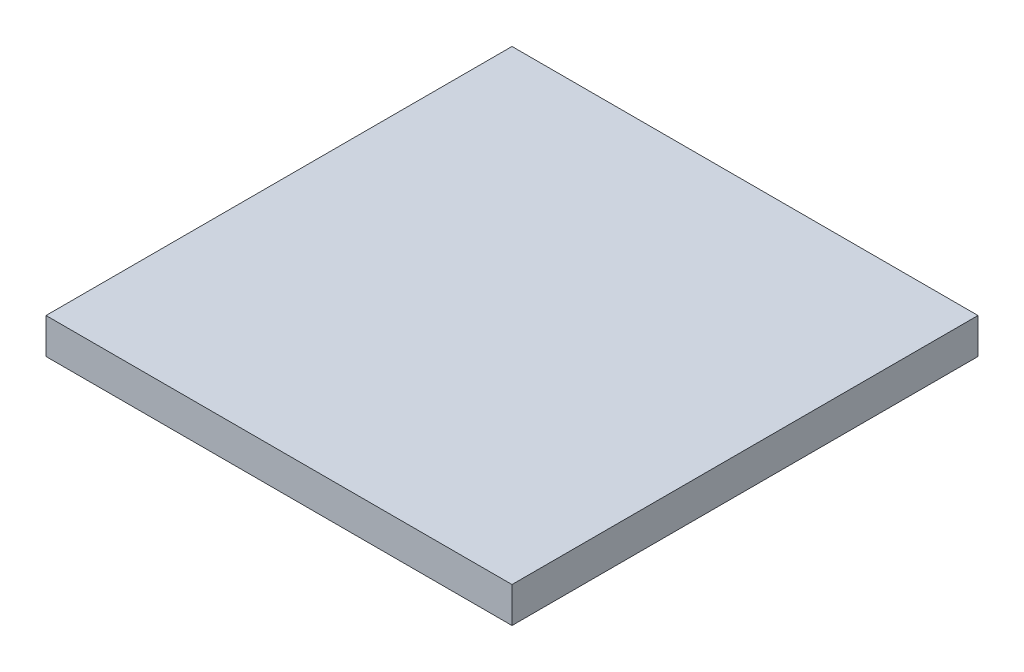
ISO-10303-21;
HEADER;
FILE_DESCRIPTION(('STEP AP214'),'2;1');
FILE_NAME('part.step','',(''),(''),'','','');
FILE_SCHEMA(('AUTOMOTIVE_DESIGN { 1 0 10303 214 1 1 1 1 }'));
ENDSEC;
DATA;
#1=APPLICATION_CONTEXT('core data for automotive mechanical design processes');
#2=APPLICATION_PROTOCOL_DEFINITION('international standard','automotive_design',2000,#1);
#3=PRODUCT_CONTEXT('',#1,'mechanical');
#4=PRODUCT('Part','Part','',(#3));
#5=PRODUCT_RELATED_PRODUCT_CATEGORY('part','',(#4));
#6=PRODUCT_DEFINITION_FORMATION('','',#4);
#7=PRODUCT_DEFINITION_CONTEXT('part definition',#1,'design');
#8=PRODUCT_DEFINITION('design','',#6,#7);
#9=PRODUCT_DEFINITION_SHAPE('','',#8);
#10=(LENGTH_UNIT() NAMED_UNIT(*) SI_UNIT(.MILLI.,.METRE.));
#11=(NAMED_UNIT(*) PLANE_ANGLE_UNIT() SI_UNIT($,.RADIAN.));
#12=(NAMED_UNIT(*) SI_UNIT($,.STERADIAN.) SOLID_ANGLE_UNIT());
#13=UNCERTAINTY_MEASURE_WITH_UNIT(LENGTH_MEASURE(1.E-05),#10,'distance_accuracy_value','');
#14=(GEOMETRIC_REPRESENTATION_CONTEXT(3) GLOBAL_UNCERTAINTY_ASSIGNED_CONTEXT((#13)) GLOBAL_UNIT_ASSIGNED_CONTEXT((#10,
#11,#12)) REPRESENTATION_CONTEXT('',''));
#15=CARTESIAN_POINT('',(0.,0.,0.));
#16=DIRECTION('',(0.,0.,1.));
#17=DIRECTION('',(1.,0.,0.));
#18=AXIS2_PLACEMENT_3D('',#15,#16,#17);
#19=CARTESIAN_POINT('',(0.,3.05,0.));
#20=DIRECTION('',(1.,0.,0.));
#21=DIRECTION('',(0.,0.,-1.));
#22=AXIS2_PLACEMENT_3D('',#19,#20,#21);
#23=PLANE('',#22);
#24=DIRECTION('',(0.,0.,1.));
#25=VECTOR('',#24,1.);
#26=CARTESIAN_POINT('',(0.,0.,0.));
#27=LINE('',#26,#25);
#28=CARTESIAN_POINT('',(0.,0.,-40.));
#29=VERTEX_POINT('',#28);
#30=CARTESIAN_POINT('',(0.,0.,0.));
#31=VERTEX_POINT('',#30);
#32=EDGE_CURVE('E111',#29,#31,#27,.T.);
#33=ORIENTED_EDGE('',*,*,#32,.T.);
#34=DIRECTION('',(0.,-1.,0.));
#35=VECTOR('',#34,1.);
#36=CARTESIAN_POINT('',(0.,3.05,0.));
#37=LINE('',#36,#35);
#38=CARTESIAN_POINT('',(0.,3.05,0.));
#39=VERTEX_POINT('',#38);
#40=EDGE_CURVE('E11',#39,#31,#37,.T.);
#41=ORIENTED_EDGE('',*,*,#40,.F.);
#42=DIRECTION('',(0.,0.,1.));
#43=VECTOR('',#42,1.);
#44=CARTESIAN_POINT('',(0.,3.05,0.));
#45=LINE('',#44,#43);
#46=CARTESIAN_POINT('',(0.,3.05,-40.));
#47=VERTEX_POINT('',#46);
#48=EDGE_CURVE('E95',#47,#39,#45,.T.);
#49=ORIENTED_EDGE('',*,*,#48,.F.);
#50=DIRECTION('',(0.,-1.,0.));
#51=VECTOR('',#50,1.);
#52=CARTESIAN_POINT('',(0.,3.05,-40.));
#53=LINE('',#52,#51);
#54=EDGE_CURVE('E107',#47,#29,#53,.T.);
#55=ORIENTED_EDGE('',*,*,#54,.T.);
#56=EDGE_LOOP('',(#33,#41,#49,#55));
#57=FACE_BOUND('',#56,.T.);
#58=ADVANCED_FACE('F43',(#57),#23,.F.);
#59=CARTESIAN_POINT('',(0.,3.05,0.));
#60=DIRECTION('',(0.,0.,-1.));
#61=DIRECTION('',(-1.,0.,0.));
#62=AXIS2_PLACEMENT_3D('',#59,#60,#61);
#63=PLANE('',#62);
#64=DIRECTION('',(1.,0.,0.));
#65=VECTOR('',#64,1.);
#66=CARTESIAN_POINT('',(0.,0.,0.));
#67=LINE('',#66,#65);
#68=CARTESIAN_POINT('',(40.,0.,0.));
#69=VERTEX_POINT('',#68);
#70=EDGE_CURVE('E100',#31,#69,#67,.T.);
#71=ORIENTED_EDGE('',*,*,#70,.T.);
#72=DIRECTION('',(0.,-1.,0.));
#73=VECTOR('',#72,1.);
#74=CARTESIAN_POINT('',(40.,3.05,0.));
#75=LINE('',#74,#73);
#76=CARTESIAN_POINT('',(40.,3.05,0.));
#77=VERTEX_POINT('',#76);
#78=EDGE_CURVE('E52',#77,#69,#75,.T.);
#79=ORIENTED_EDGE('',*,*,#78,.F.);
#80=DIRECTION('',(1.,0.,0.));
#81=VECTOR('',#80,1.);
#82=CARTESIAN_POINT('',(0.,3.05,0.));
#83=LINE('',#82,#81);
#84=EDGE_CURVE('E90',#39,#77,#83,.T.);
#85=ORIENTED_EDGE('',*,*,#84,.F.);
#86=ORIENTED_EDGE('',*,*,#40,.T.);
#87=EDGE_LOOP('',(#71,#79,#85,#86));
#88=FACE_BOUND('',#87,.T.);
#89=ADVANCED_FACE('F99',(#88),#63,.F.);
#90=CARTESIAN_POINT('',(40.,3.05,0.));
#91=DIRECTION('',(-1.,0.,0.));
#92=DIRECTION('',(0.,0.,1.));
#93=AXIS2_PLACEMENT_3D('',#90,#91,#92);
#94=PLANE('',#93);
#95=DIRECTION('',(0.,0.,-1.));
#96=VECTOR('',#95,1.);
#97=CARTESIAN_POINT('',(40.,0.,0.));
#98=LINE('',#97,#96);
#99=CARTESIAN_POINT('',(40.,0.,-40.));
#100=VERTEX_POINT('',#99);
#101=EDGE_CURVE('E77',#69,#100,#98,.T.);
#102=ORIENTED_EDGE('',*,*,#101,.T.);
#103=DIRECTION('',(0.,-1.,0.));
#104=VECTOR('',#103,1.);
#105=CARTESIAN_POINT('',(40.,3.05,-40.));
#106=LINE('',#105,#104);
#107=CARTESIAN_POINT('',(40.,3.05,-40.));
#108=VERTEX_POINT('',#107);
#109=EDGE_CURVE('E102',#108,#100,#106,.T.);
#110=ORIENTED_EDGE('',*,*,#109,.F.);
#111=DIRECTION('',(0.,0.,-1.));
#112=VECTOR('',#111,1.);
#113=CARTESIAN_POINT('',(40.,3.05,0.));
#114=LINE('',#113,#112);
#115=EDGE_CURVE('E93',#77,#108,#114,.T.);
#116=ORIENTED_EDGE('',*,*,#115,.F.);
#117=ORIENTED_EDGE('',*,*,#78,.T.);
#118=EDGE_LOOP('',(#102,#110,#116,#117));
#119=FACE_BOUND('',#118,.T.);
#120=ADVANCED_FACE('F103',(#119),#94,.F.);
#121=CARTESIAN_POINT('',(0.,3.05,-40.));
#122=DIRECTION('',(0.,0.,1.));
#123=DIRECTION('',(1.,0.,0.));
#124=AXIS2_PLACEMENT_3D('',#121,#122,#123);
#125=PLANE('',#124);
#126=DIRECTION('',(-1.,0.,0.));
#127=VECTOR('',#126,1.);
#128=CARTESIAN_POINT('',(0.,0.,-40.));
#129=LINE('',#128,#127);
#130=EDGE_CURVE('E83',#100,#29,#129,.T.);
#131=ORIENTED_EDGE('',*,*,#130,.T.);
#132=ORIENTED_EDGE('',*,*,#54,.F.);
#133=DIRECTION('',(-1.,0.,0.));
#134=VECTOR('',#133,1.);
#135=CARTESIAN_POINT('',(0.,3.05,-40.));
#136=LINE('',#135,#134);
#137=EDGE_CURVE('E60',#108,#47,#136,.T.);
#138=ORIENTED_EDGE('',*,*,#137,.F.);
#139=ORIENTED_EDGE('',*,*,#109,.T.);
#140=EDGE_LOOP('',(#131,#132,#138,#139));
#141=FACE_BOUND('',#140,.T.);
#142=ADVANCED_FACE('F124',(#141),#125,.F.);
#143=CARTESIAN_POINT('',(0.,3.05,0.));
#144=DIRECTION('',(0.,-1.,0.));
#145=DIRECTION('',(0.,0.,-1.));
#146=AXIS2_PLACEMENT_3D('',#143,#144,#145);
#147=PLANE('',#146);
#148=ORIENTED_EDGE('',*,*,#48,.T.);
#149=ORIENTED_EDGE('',*,*,#84,.T.);
#150=ORIENTED_EDGE('',*,*,#115,.T.);
#151=ORIENTED_EDGE('',*,*,#137,.T.);
#152=EDGE_LOOP('',(#148,#149,#150,#151));
#153=FACE_BOUND('',#152,.T.);
#154=ADVANCED_FACE('F91',(#153),#147,.F.);
#155=CARTESIAN_POINT('',(0.,0.,0.));
#156=DIRECTION('',(0.,-1.,0.));
#157=DIRECTION('',(0.,0.,-1.));
#158=AXIS2_PLACEMENT_3D('',#155,#156,#157);
#159=PLANE('',#158);
#160=ORIENTED_EDGE('',*,*,#32,.F.);
#161=ORIENTED_EDGE('',*,*,#130,.F.);
#162=ORIENTED_EDGE('',*,*,#101,.F.);
#163=ORIENTED_EDGE('',*,*,#70,.F.);
#164=EDGE_LOOP('',(#160,#161,#162,#163));
#165=FACE_BOUND('',#164,.T.);
#166=ADVANCED_FACE('F127',(#165),#159,.T.);
#167=CLOSED_SHELL('',(#58,#89,#120,#142,#154,#166));
#168=MANIFOLD_SOLID_BREP('B2',#167);
#169=ADVANCED_BREP_SHAPE_REPRESENTATION('',(#18,#168),#14);
#170=SHAPE_DEFINITION_REPRESENTATION(#9,#169);
ENDSEC;
END-ISO-10303-21;
